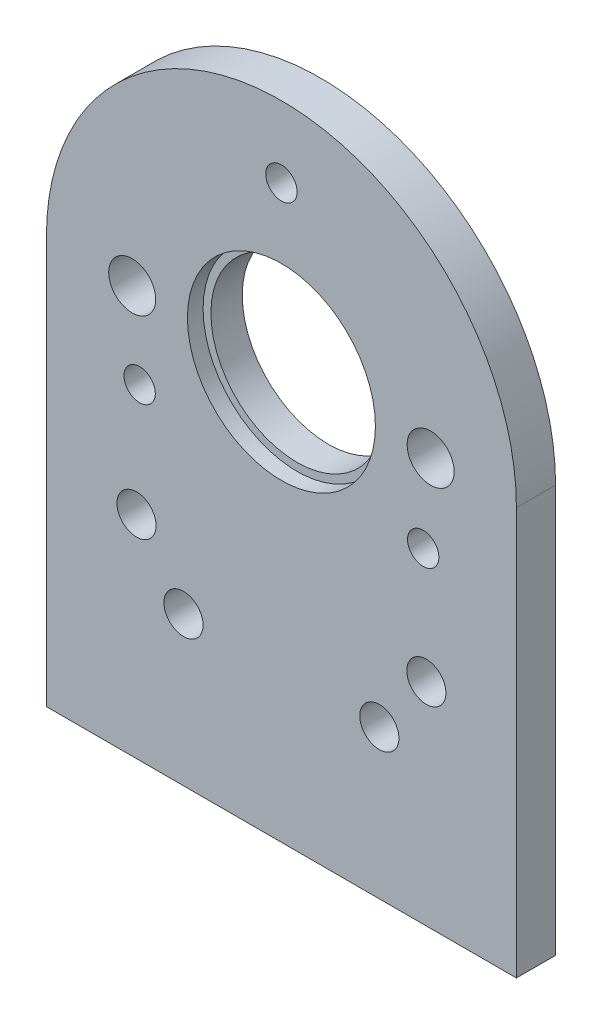
ISO-10303-21;
HEADER;
FILE_DESCRIPTION(('STEP AP214'),'2;1');
FILE_NAME('part.step','',(''),(''),'','','');
FILE_SCHEMA(('AUTOMOTIVE_DESIGN { 1 0 10303 214 1 1 1 1 }'));
ENDSEC;
DATA;
#1=APPLICATION_CONTEXT('core data for automotive mechanical design processes');
#2=APPLICATION_PROTOCOL_DEFINITION('international standard','automotive_design',2000,#1);
#3=PRODUCT_CONTEXT('',#1,'mechanical');
#4=PRODUCT('Part','Part','',(#3));
#5=PRODUCT_RELATED_PRODUCT_CATEGORY('part','',(#4));
#6=PRODUCT_DEFINITION_FORMATION('','',#4);
#7=PRODUCT_DEFINITION_CONTEXT('part definition',#1,'design');
#8=PRODUCT_DEFINITION('design','',#6,#7);
#9=PRODUCT_DEFINITION_SHAPE('','',#8);
#10=(LENGTH_UNIT() NAMED_UNIT(*) SI_UNIT(.MILLI.,.METRE.));
#11=(NAMED_UNIT(*) PLANE_ANGLE_UNIT() SI_UNIT($,.RADIAN.));
#12=(NAMED_UNIT(*) SI_UNIT($,.STERADIAN.) SOLID_ANGLE_UNIT());
#13=UNCERTAINTY_MEASURE_WITH_UNIT(LENGTH_MEASURE(1.E-05),#10,'distance_accuracy_value','');
#14=(GEOMETRIC_REPRESENTATION_CONTEXT(3) GLOBAL_UNCERTAINTY_ASSIGNED_CONTEXT((#13)) GLOBAL_UNIT_ASSIGNED_CONTEXT((#10,
#11,#12)) REPRESENTATION_CONTEXT('',''));
#15=CARTESIAN_POINT('',(0.,0.,0.));
#16=DIRECTION('',(0.,0.,1.));
#17=DIRECTION('',(1.,0.,0.));
#18=AXIS2_PLACEMENT_3D('',#15,#16,#17);
#19=CARTESIAN_POINT('',(0.,0.,0.5));
#20=DIRECTION('',(0.,0.,1.));
#21=DIRECTION('',(1.,0.,0.));
#22=AXIS2_PLACEMENT_3D('',#19,#20,#21);
#23=PLANE('',#22);
#24=CARTESIAN_POINT('',(0.,0.,0.5));
#25=DIRECTION('',(0.,0.,1.));
#26=DIRECTION('',(1.,0.,0.));
#27=AXIS2_PLACEMENT_3D('',#24,#25,#26);
#28=CIRCLE('',#27,15.);
#29=CARTESIAN_POINT('',(15.,0.,0.5));
#30=VERTEX_POINT('',#29);
#31=CARTESIAN_POINT('',(-15.,0.,0.5));
#32=VERTEX_POINT('',#31);
#33=EDGE_CURVE('E131',#30,#32,#28,.T.);
#34=ORIENTED_EDGE('',*,*,#33,.F.);
#35=DIRECTION('',(0.,1.,0.));
#36=VECTOR('',#35,1.);
#37=CARTESIAN_POINT('',(15.,-26.,0.5));
#38=LINE('',#37,#36);
#39=CARTESIAN_POINT('',(15.,-26.,0.5));
#40=VERTEX_POINT('',#39);
#41=EDGE_CURVE('E141',#40,#30,#38,.T.);
#42=ORIENTED_EDGE('',*,*,#41,.F.);
#43=DIRECTION('',(1.,0.,0.));
#44=VECTOR('',#43,1.);
#45=CARTESIAN_POINT('',(-15.,-26.,0.5));
#46=LINE('',#45,#44);
#47=CARTESIAN_POINT('',(-15.,-26.,0.5));
#48=VERTEX_POINT('',#47);
#49=EDGE_CURVE('E138',#48,#40,#46,.T.);
#50=ORIENTED_EDGE('',*,*,#49,.F.);
#51=DIRECTION('',(0.,-1.,0.));
#52=VECTOR('',#51,1.);
#53=CARTESIAN_POINT('',(-15.,0.,0.5));
#54=LINE('',#53,#52);
#55=EDGE_CURVE('E134',#32,#48,#54,.T.);
#56=ORIENTED_EDGE('',*,*,#55,.F.);
#57=EDGE_LOOP('',(#34,#42,#50,#56));
#58=FACE_BOUND('',#57,.T.);
#59=DIRECTION('',(-1.,0.,0.));
#60=VECTOR('',#59,1.);
#61=CARTESIAN_POINT('',(-14.25,-25.25,0.5));
#62=LINE('',#61,#60);
#63=CARTESIAN_POINT('',(14.25,-25.25,0.5));
#64=VERTEX_POINT('',#63);
#65=CARTESIAN_POINT('',(-14.25,-25.25,0.5));
#66=VERTEX_POINT('',#65);
#67=EDGE_CURVE('E121',#64,#66,#62,.T.);
#68=ORIENTED_EDGE('',*,*,#67,.F.);
#69=DIRECTION('',(0.,-1.,0.));
#70=VECTOR('',#69,1.);
#71=CARTESIAN_POINT('',(14.25,-25.25,0.5));
#72=LINE('',#71,#70);
#73=CARTESIAN_POINT('',(14.25,0.,0.5));
#74=VERTEX_POINT('',#73);
#75=EDGE_CURVE('E118',#74,#64,#72,.T.);
#76=ORIENTED_EDGE('',*,*,#75,.F.);
#77=CARTESIAN_POINT('',(0.,0.,0.5));
#78=DIRECTION('',(0.,0.,-1.));
#79=DIRECTION('',(1.,0.,0.));
#80=AXIS2_PLACEMENT_3D('',#77,#78,#79);
#81=CIRCLE('',#80,14.25);
#82=CARTESIAN_POINT('',(-14.25,0.,0.5));
#83=VERTEX_POINT('',#82);
#84=EDGE_CURVE('E57',#83,#74,#81,.T.);
#85=ORIENTED_EDGE('',*,*,#84,.F.);
#86=DIRECTION('',(0.,1.,0.));
#87=VECTOR('',#86,1.);
#88=CARTESIAN_POINT('',(-14.25,0.,0.5));
#89=LINE('',#88,#87);
#90=EDGE_CURVE('E52',#66,#83,#89,.T.);
#91=ORIENTED_EDGE('',*,*,#90,.F.);
#92=EDGE_LOOP('',(#68,#76,#85,#91));
#93=FACE_BOUND('',#92,.T.);
#94=ADVANCED_FACE('F35',(#58,#93),#23,.F.);
#95=CARTESIAN_POINT('',(0.,0.,0.5));
#96=DIRECTION('',(0.,0.,1.));
#97=DIRECTION('',(1.,0.,0.));
#98=AXIS2_PLACEMENT_3D('',#95,#96,#97);
#99=CYLINDRICAL_SURFACE('',#98,15.);
#100=CARTESIAN_POINT('',(0.,0.,3.));
#101=DIRECTION('',(0.,0.,1.));
#102=DIRECTION('',(1.,0.,0.));
#103=AXIS2_PLACEMENT_3D('',#100,#101,#102);
#104=CIRCLE('',#103,15.);
#105=CARTESIAN_POINT('',(15.,0.,3.));
#106=VERTEX_POINT('',#105);
#107=CARTESIAN_POINT('',(-15.,0.,3.));
#108=VERTEX_POINT('',#107);
#109=EDGE_CURVE('E122',#106,#108,#104,.T.);
#110=ORIENTED_EDGE('',*,*,#109,.F.);
#111=DIRECTION('',(0.,0.,1.));
#112=VECTOR('',#111,1.);
#113=CARTESIAN_POINT('',(15.,0.,0.5));
#114=LINE('',#113,#112);
#115=EDGE_CURVE('E11',#30,#106,#114,.T.);
#116=ORIENTED_EDGE('',*,*,#115,.F.);
#117=ORIENTED_EDGE('',*,*,#33,.T.);
#118=DIRECTION('',(0.,0.,1.));
#119=VECTOR('',#118,1.);
#120=CARTESIAN_POINT('',(-15.,0.,0.5));
#121=LINE('',#120,#119);
#122=EDGE_CURVE('E39',#32,#108,#121,.T.);
#123=ORIENTED_EDGE('',*,*,#122,.T.);
#124=EDGE_LOOP('',(#110,#116,#117,#123));
#125=FACE_BOUND('',#124,.T.);
#126=ADVANCED_FACE('F37',(#125),#99,.T.);
#127=CARTESIAN_POINT('',(15.,-26.,0.5));
#128=DIRECTION('',(1.,0.,0.));
#129=DIRECTION('',(0.,0.,-1.));
#130=AXIS2_PLACEMENT_3D('',#127,#128,#129);
#131=PLANE('',#130);
#132=DIRECTION('',(0.,1.,0.));
#133=VECTOR('',#132,1.);
#134=CARTESIAN_POINT('',(15.,-26.,3.));
#135=LINE('',#134,#133);
#136=CARTESIAN_POINT('',(15.,-26.,3.));
#137=VERTEX_POINT('',#136);
#138=EDGE_CURVE('E135',#137,#106,#135,.T.);
#139=ORIENTED_EDGE('',*,*,#138,.F.);
#140=DIRECTION('',(0.,0.,1.));
#141=VECTOR('',#140,1.);
#142=CARTESIAN_POINT('',(15.,-26.,0.5));
#143=LINE('',#142,#141);
#144=EDGE_CURVE('E44',#40,#137,#143,.T.);
#145=ORIENTED_EDGE('',*,*,#144,.F.);
#146=ORIENTED_EDGE('',*,*,#41,.T.);
#147=ORIENTED_EDGE('',*,*,#115,.T.);
#148=EDGE_LOOP('',(#139,#145,#146,#147));
#149=FACE_BOUND('',#148,.T.);
#150=ADVANCED_FACE('F164',(#149),#131,.T.);
#151=CARTESIAN_POINT('',(-15.,-26.,0.5));
#152=DIRECTION('',(0.,-1.,0.));
#153=DIRECTION('',(0.,0.,-1.));
#154=AXIS2_PLACEMENT_3D('',#151,#152,#153);
#155=PLANE('',#154);
#156=DIRECTION('',(1.,0.,0.));
#157=VECTOR('',#156,1.);
#158=CARTESIAN_POINT('',(-15.,-26.,3.));
#159=LINE('',#158,#157);
#160=CARTESIAN_POINT('',(-15.,-26.,3.));
#161=VERTEX_POINT('',#160);
#162=EDGE_CURVE('E146',#161,#137,#159,.T.);
#163=ORIENTED_EDGE('',*,*,#162,.F.);
#164=DIRECTION('',(0.,0.,1.));
#165=VECTOR('',#164,1.);
#166=CARTESIAN_POINT('',(-15.,-26.,0.5));
#167=LINE('',#166,#165);
#168=EDGE_CURVE('E151',#48,#161,#167,.T.);
#169=ORIENTED_EDGE('',*,*,#168,.F.);
#170=ORIENTED_EDGE('',*,*,#49,.T.);
#171=ORIENTED_EDGE('',*,*,#144,.T.);
#172=EDGE_LOOP('',(#163,#169,#170,#171));
#173=FACE_BOUND('',#172,.T.);
#174=ADVANCED_FACE('F169',(#173),#155,.T.);
#175=CARTESIAN_POINT('',(-15.,0.,0.5));
#176=DIRECTION('',(-1.,0.,0.));
#177=DIRECTION('',(0.,0.,1.));
#178=AXIS2_PLACEMENT_3D('',#175,#176,#177);
#179=PLANE('',#178);
#180=DIRECTION('',(0.,-1.,0.));
#181=VECTOR('',#180,1.);
#182=CARTESIAN_POINT('',(-15.,0.,3.));
#183=LINE('',#182,#181);
#184=EDGE_CURVE('E125',#108,#161,#183,.T.);
#185=ORIENTED_EDGE('',*,*,#184,.F.);
#186=ORIENTED_EDGE('',*,*,#122,.F.);
#187=ORIENTED_EDGE('',*,*,#55,.T.);
#188=ORIENTED_EDGE('',*,*,#168,.T.);
#189=EDGE_LOOP('',(#185,#186,#187,#188));
#190=FACE_BOUND('',#189,.T.);
#191=ADVANCED_FACE('F159',(#190),#179,.T.);
#192=CARTESIAN_POINT('',(0.,0.,3.));
#193=DIRECTION('',(0.,0.,1.));
#194=DIRECTION('',(1.,0.,0.));
#195=AXIS2_PLACEMENT_3D('',#192,#193,#194);
#196=PLANE('',#195);
#197=CARTESIAN_POINT('',(0.,0.,3.));
#198=DIRECTION('',(0.,0.,1.));
#199=DIRECTION('',(1.,0.,0.));
#200=AXIS2_PLACEMENT_3D('',#197,#198,#199);
#201=CIRCLE('',#200,5.99999999999999);
#202=CARTESIAN_POINT('',(5.99999999999999,0.,3.));
#203=VERTEX_POINT('',#202);
#204=EDGE_CURVE('E193',#203,#203,#201,.T.);
#205=ORIENTED_EDGE('',*,*,#204,.F.);
#206=EDGE_LOOP('',(#205));
#207=FACE_BOUND('',#206,.T.);
#208=CARTESIAN_POINT('',(0.,10.45,3.));
#209=DIRECTION('',(0.,0.,-1.));
#210=DIRECTION('',(-1.,0.,0.));
#211=AXIS2_PLACEMENT_3D('',#208,#209,#210);
#212=CIRCLE('',#211,0.999999999999987);
#213=CARTESIAN_POINT('',(-0.999999999999987,10.45,3.));
#214=VERTEX_POINT('',#213);
#215=EDGE_CURVE('E197',#214,#214,#212,.T.);
#216=ORIENTED_EDGE('',*,*,#215,.T.);
#217=EDGE_LOOP('',(#216));
#218=FACE_BOUND('',#217,.T.);
#219=CARTESIAN_POINT('',(-9.04996546954738,-5.225,3.));
#220=DIRECTION('',(0.,0.,-1.));
#221=DIRECTION('',(-1.,0.,0.));
#222=AXIS2_PLACEMENT_3D('',#219,#220,#221);
#223=CIRCLE('',#222,0.999999999999987);
#224=CARTESIAN_POINT('',(-10.0499654695474,-5.225,3.));
#225=VERTEX_POINT('',#224);
#226=EDGE_CURVE('E201',#225,#225,#223,.T.);
#227=ORIENTED_EDGE('',*,*,#226,.T.);
#228=EDGE_LOOP('',(#227));
#229=FACE_BOUND('',#228,.T.);
#230=CARTESIAN_POINT('',(9.04996546954736,-5.225,3.));
#231=DIRECTION('',(0.,0.,-1.));
#232=DIRECTION('',(-1.,0.,0.));
#233=AXIS2_PLACEMENT_3D('',#230,#231,#232);
#234=CIRCLE('',#233,0.999999999999987);
#235=CARTESIAN_POINT('',(8.04996546954737,-5.225,3.));
#236=VERTEX_POINT('',#235);
#237=EDGE_CURVE('E205',#236,#236,#234,.T.);
#238=ORIENTED_EDGE('',*,*,#237,.T.);
#239=EDGE_LOOP('',(#238));
#240=FACE_BOUND('',#239,.T.);
#241=CARTESIAN_POINT('',(9.525,0.,3.));
#242=DIRECTION('',(0.,0.,-1.));
#243=DIRECTION('',(-1.,0.,0.));
#244=AXIS2_PLACEMENT_3D('',#241,#242,#243);
#245=CIRCLE('',#244,1.49999999999999);
#246=CARTESIAN_POINT('',(8.02500000000001,0.,3.));
#247=VERTEX_POINT('',#246);
#248=EDGE_CURVE('E209',#247,#247,#245,.T.);
#249=ORIENTED_EDGE('',*,*,#248,.T.);
#250=EDGE_LOOP('',(#249));
#251=FACE_BOUND('',#250,.T.);
#252=CARTESIAN_POINT('',(-9.525,0.,3.));
#253=DIRECTION('',(0.,0.,-1.));
#254=DIRECTION('',(-1.,0.,0.));
#255=AXIS2_PLACEMENT_3D('',#252,#253,#254);
#256=CIRCLE('',#255,1.49999999999999);
#257=CARTESIAN_POINT('',(-11.025,0.,3.));
#258=VERTEX_POINT('',#257);
#259=EDGE_CURVE('E213',#258,#258,#256,.T.);
#260=ORIENTED_EDGE('',*,*,#259,.T.);
#261=EDGE_LOOP('',(#260));
#262=FACE_BOUND('',#261,.T.);
#263=CARTESIAN_POINT('',(-9.25,-12.5,3.));
#264=DIRECTION('',(0.,0.,-1.));
#265=DIRECTION('',(-1.,0.,0.));
#266=AXIS2_PLACEMENT_3D('',#263,#264,#265);
#267=CIRCLE('',#266,1.24999999999999);
#268=CARTESIAN_POINT('',(-10.5,-12.5,3.));
#269=VERTEX_POINT('',#268);
#270=EDGE_CURVE('E217',#269,#269,#267,.T.);
#271=ORIENTED_EDGE('',*,*,#270,.T.);
#272=EDGE_LOOP('',(#271));
#273=FACE_BOUND('',#272,.T.);
#274=CARTESIAN_POINT('',(9.25,-12.5,3.));
#275=DIRECTION('',(0.,0.,-1.));
#276=DIRECTION('',(-1.,0.,0.));
#277=AXIS2_PLACEMENT_3D('',#274,#275,#276);
#278=CIRCLE('',#277,1.24999999999999);
#279=CARTESIAN_POINT('',(8.00000000000001,-12.5,3.));
#280=VERTEX_POINT('',#279);
#281=EDGE_CURVE('E221',#280,#280,#278,.T.);
#282=ORIENTED_EDGE('',*,*,#281,.T.);
#283=EDGE_LOOP('',(#282));
#284=FACE_BOUND('',#283,.T.);
#285=CARTESIAN_POINT('',(-6.25,-16.5,3.));
#286=DIRECTION('',(0.,0.,-1.));
#287=DIRECTION('',(-1.,0.,0.));
#288=AXIS2_PLACEMENT_3D('',#285,#286,#287);
#289=CIRCLE('',#288,1.24999999999999);
#290=CARTESIAN_POINT('',(-7.49999999999999,-16.5,3.));
#291=VERTEX_POINT('',#290);
#292=EDGE_CURVE('E225',#291,#291,#289,.T.);
#293=ORIENTED_EDGE('',*,*,#292,.T.);
#294=EDGE_LOOP('',(#293));
#295=FACE_BOUND('',#294,.T.);
#296=CARTESIAN_POINT('',(6.25,-16.5,3.));
#297=DIRECTION('',(0.,0.,-1.));
#298=DIRECTION('',(-1.,0.,0.));
#299=AXIS2_PLACEMENT_3D('',#296,#297,#298);
#300=CIRCLE('',#299,1.24999999999999);
#301=CARTESIAN_POINT('',(5.00000000000001,-16.5,3.));
#302=VERTEX_POINT('',#301);
#303=EDGE_CURVE('E228',#302,#302,#300,.T.);
#304=ORIENTED_EDGE('',*,*,#303,.T.);
#305=EDGE_LOOP('',(#304));
#306=FACE_BOUND('',#305,.T.);
#307=ORIENTED_EDGE('',*,*,#109,.T.);
#308=ORIENTED_EDGE('',*,*,#184,.T.);
#309=ORIENTED_EDGE('',*,*,#162,.T.);
#310=ORIENTED_EDGE('',*,*,#138,.T.);
#311=EDGE_LOOP('',(#307,#308,#309,#310));
#312=FACE_BOUND('',#311,.T.);
#313=ADVANCED_FACE('F161',(#207,#218,#229,#240,#251,#262,#273,#284,#295,#306,#312),#196,.T.);
#314=CARTESIAN_POINT('',(-14.25,-25.25,0.));
#315=DIRECTION('',(0.,1.,0.));
#316=DIRECTION('',(0.,0.,1.));
#317=AXIS2_PLACEMENT_3D('',#314,#315,#316);
#318=PLANE('',#317);
#319=ORIENTED_EDGE('',*,*,#67,.T.);
#320=DIRECTION('',(0.,0.,1.));
#321=VECTOR('',#320,1.);
#322=CARTESIAN_POINT('',(-14.25,-25.25,0.));
#323=LINE('',#322,#321);
#324=CARTESIAN_POINT('',(-14.25,-25.25,0.));
#325=VERTEX_POINT('',#324);
#326=EDGE_CURVE('E102',#325,#66,#323,.T.);
#327=ORIENTED_EDGE('',*,*,#326,.F.);
#328=DIRECTION('',(-1.,0.,0.));
#329=VECTOR('',#328,1.);
#330=CARTESIAN_POINT('',(-14.25,-25.25,0.));
#331=LINE('',#330,#329);
#332=CARTESIAN_POINT('',(14.25,-25.25,0.));
#333=VERTEX_POINT('',#332);
#334=EDGE_CURVE('E109',#333,#325,#331,.T.);
#335=ORIENTED_EDGE('',*,*,#334,.F.);
#336=DIRECTION('',(0.,0.,1.));
#337=VECTOR('',#336,1.);
#338=CARTESIAN_POINT('',(14.25,-25.25,0.));
#339=LINE('',#338,#337);
#340=EDGE_CURVE('E238',#333,#64,#339,.T.);
#341=ORIENTED_EDGE('',*,*,#340,.T.);
#342=EDGE_LOOP('',(#319,#327,#335,#341));
#343=FACE_BOUND('',#342,.T.);
#344=ADVANCED_FACE('F120',(#343),#318,.F.);
#345=CARTESIAN_POINT('',(-14.25,0.,0.));
#346=DIRECTION('',(1.,0.,0.));
#347=DIRECTION('',(0.,0.,-1.));
#348=AXIS2_PLACEMENT_3D('',#345,#346,#347);
#349=PLANE('',#348);
#350=ORIENTED_EDGE('',*,*,#90,.T.);
#351=DIRECTION('',(0.,0.,1.));
#352=VECTOR('',#351,1.);
#353=CARTESIAN_POINT('',(-14.25,0.,0.));
#354=LINE('',#353,#352);
#355=CARTESIAN_POINT('',(-14.25,0.,0.));
#356=VERTEX_POINT('',#355);
#357=EDGE_CURVE('E105',#356,#83,#354,.T.);
#358=ORIENTED_EDGE('',*,*,#357,.F.);
#359=DIRECTION('',(0.,1.,0.));
#360=VECTOR('',#359,1.);
#361=CARTESIAN_POINT('',(-14.25,0.,0.));
#362=LINE('',#361,#360);
#363=EDGE_CURVE('E98',#325,#356,#362,.T.);
#364=ORIENTED_EDGE('',*,*,#363,.F.);
#365=ORIENTED_EDGE('',*,*,#326,.T.);
#366=EDGE_LOOP('',(#350,#358,#364,#365));
#367=FACE_BOUND('',#366,.T.);
#368=ADVANCED_FACE('F100',(#367),#349,.F.);
#369=CARTESIAN_POINT('',(0.,0.,0.));
#370=DIRECTION('',(0.,0.,1.));
#371=DIRECTION('',(1.,0.,0.));
#372=AXIS2_PLACEMENT_3D('',#369,#370,#371);
#373=CYLINDRICAL_SURFACE('',#372,14.25);
#374=ORIENTED_EDGE('',*,*,#84,.T.);
#375=DIRECTION('',(0.,0.,1.));
#376=VECTOR('',#375,1.);
#377=CARTESIAN_POINT('',(14.25,0.,0.));
#378=LINE('',#377,#376);
#379=CARTESIAN_POINT('',(14.25,0.,0.));
#380=VERTEX_POINT('',#379);
#381=EDGE_CURVE('E127',#380,#74,#378,.T.);
#382=ORIENTED_EDGE('',*,*,#381,.F.);
#383=CARTESIAN_POINT('',(0.,0.,0.));
#384=DIRECTION('',(0.,0.,-1.));
#385=DIRECTION('',(1.,0.,0.));
#386=AXIS2_PLACEMENT_3D('',#383,#384,#385);
#387=CIRCLE('',#386,14.25);
#388=EDGE_CURVE('E108',#356,#380,#387,.T.);
#389=ORIENTED_EDGE('',*,*,#388,.F.);
#390=ORIENTED_EDGE('',*,*,#357,.T.);
#391=EDGE_LOOP('',(#374,#382,#389,#390));
#392=FACE_BOUND('',#391,.T.);
#393=ADVANCED_FACE('F249',(#392),#373,.T.);
#394=CARTESIAN_POINT('',(14.25,-25.25,0.));
#395=DIRECTION('',(-1.,0.,0.));
#396=DIRECTION('',(0.,0.,1.));
#397=AXIS2_PLACEMENT_3D('',#394,#395,#396);
#398=PLANE('',#397);
#399=ORIENTED_EDGE('',*,*,#75,.T.);
#400=ORIENTED_EDGE('',*,*,#340,.F.);
#401=DIRECTION('',(0.,-1.,0.));
#402=VECTOR('',#401,1.);
#403=CARTESIAN_POINT('',(14.25,-25.25,0.));
#404=LINE('',#403,#402);
#405=EDGE_CURVE('E114',#380,#333,#404,.T.);
#406=ORIENTED_EDGE('',*,*,#405,.F.);
#407=ORIENTED_EDGE('',*,*,#381,.T.);
#408=EDGE_LOOP('',(#399,#400,#406,#407));
#409=FACE_BOUND('',#408,.T.);
#410=ADVANCED_FACE('F247',(#409),#398,.F.);
#411=CARTESIAN_POINT('',(0.,0.,0.));
#412=DIRECTION('',(0.,0.,1.));
#413=DIRECTION('',(1.,0.,0.));
#414=AXIS2_PLACEMENT_3D('',#411,#412,#413);
#415=PLANE('',#414);
#416=CARTESIAN_POINT('',(0.,0.,0.));
#417=DIRECTION('',(0.,0.,1.));
#418=DIRECTION('',(1.,0.,0.));
#419=AXIS2_PLACEMENT_3D('',#416,#417,#418);
#420=CIRCLE('',#419,5.50000000000001);
#421=CARTESIAN_POINT('',(5.50000000000001,0.,0.));
#422=VERTEX_POINT('',#421);
#423=EDGE_CURVE('E319',#422,#422,#420,.T.);
#424=ORIENTED_EDGE('',*,*,#423,.T.);
#425=EDGE_LOOP('',(#424));
#426=FACE_BOUND('',#425,.T.);
#427=CARTESIAN_POINT('',(0.,10.45,0.));
#428=DIRECTION('',(0.,0.,-1.));
#429=DIRECTION('',(-1.,0.,0.));
#430=AXIS2_PLACEMENT_3D('',#427,#428,#429);
#431=CIRCLE('',#430,0.999999999999987);
#432=CARTESIAN_POINT('',(-0.999999999999987,10.45,0.));
#433=VERTEX_POINT('',#432);
#434=EDGE_CURVE('E322',#433,#433,#431,.T.);
#435=ORIENTED_EDGE('',*,*,#434,.F.);
#436=EDGE_LOOP('',(#435));
#437=FACE_BOUND('',#436,.T.);
#438=CARTESIAN_POINT('',(-9.04996546954738,-5.225,0.));
#439=DIRECTION('',(0.,0.,-1.));
#440=DIRECTION('',(-1.,0.,0.));
#441=AXIS2_PLACEMENT_3D('',#438,#439,#440);
#442=CIRCLE('',#441,0.999999999999987);
#443=CARTESIAN_POINT('',(-10.0499654695474,-5.225,0.));
#444=VERTEX_POINT('',#443);
#445=EDGE_CURVE('E326',#444,#444,#442,.T.);
#446=ORIENTED_EDGE('',*,*,#445,.F.);
#447=EDGE_LOOP('',(#446));
#448=FACE_BOUND('',#447,.T.);
#449=CARTESIAN_POINT('',(9.04996546954736,-5.225,0.));
#450=DIRECTION('',(0.,0.,-1.));
#451=DIRECTION('',(-1.,0.,0.));
#452=AXIS2_PLACEMENT_3D('',#449,#450,#451);
#453=CIRCLE('',#452,0.999999999999987);
#454=CARTESIAN_POINT('',(8.04996546954737,-5.225,0.));
#455=VERTEX_POINT('',#454);
#456=EDGE_CURVE('E330',#455,#455,#453,.T.);
#457=ORIENTED_EDGE('',*,*,#456,.F.);
#458=EDGE_LOOP('',(#457));
#459=FACE_BOUND('',#458,.T.);
#460=CARTESIAN_POINT('',(9.525,0.,0.));
#461=DIRECTION('',(0.,0.,-1.));
#462=DIRECTION('',(-1.,0.,0.));
#463=AXIS2_PLACEMENT_3D('',#460,#461,#462);
#464=CIRCLE('',#463,1.49999999999999);
#465=CARTESIAN_POINT('',(8.02500000000001,0.,0.));
#466=VERTEX_POINT('',#465);
#467=EDGE_CURVE('E334',#466,#466,#464,.T.);
#468=ORIENTED_EDGE('',*,*,#467,.F.);
#469=EDGE_LOOP('',(#468));
#470=FACE_BOUND('',#469,.T.);
#471=CARTESIAN_POINT('',(-9.525,0.,0.));
#472=DIRECTION('',(0.,0.,-1.));
#473=DIRECTION('',(-1.,0.,0.));
#474=AXIS2_PLACEMENT_3D('',#471,#472,#473);
#475=CIRCLE('',#474,1.49999999999999);
#476=CARTESIAN_POINT('',(-11.025,0.,0.));
#477=VERTEX_POINT('',#476);
#478=EDGE_CURVE('E338',#477,#477,#475,.T.);
#479=ORIENTED_EDGE('',*,*,#478,.F.);
#480=EDGE_LOOP('',(#479));
#481=FACE_BOUND('',#480,.T.);
#482=CARTESIAN_POINT('',(-9.25,-12.5,0.));
#483=DIRECTION('',(0.,0.,-1.));
#484=DIRECTION('',(-1.,0.,0.));
#485=AXIS2_PLACEMENT_3D('',#482,#483,#484);
#486=CIRCLE('',#485,1.24999999999999);
#487=CARTESIAN_POINT('',(-10.5,-12.5,0.));
#488=VERTEX_POINT('',#487);
#489=EDGE_CURVE('E342',#488,#488,#486,.T.);
#490=ORIENTED_EDGE('',*,*,#489,.F.);
#491=EDGE_LOOP('',(#490));
#492=FACE_BOUND('',#491,.T.);
#493=CARTESIAN_POINT('',(9.25,-12.5,0.));
#494=DIRECTION('',(0.,0.,-1.));
#495=DIRECTION('',(-1.,0.,0.));
#496=AXIS2_PLACEMENT_3D('',#493,#494,#495);
#497=CIRCLE('',#496,1.24999999999999);
#498=CARTESIAN_POINT('',(8.00000000000001,-12.5,0.));
#499=VERTEX_POINT('',#498);
#500=EDGE_CURVE('E346',#499,#499,#497,.T.);
#501=ORIENTED_EDGE('',*,*,#500,.F.);
#502=EDGE_LOOP('',(#501));
#503=FACE_BOUND('',#502,.T.);
#504=CARTESIAN_POINT('',(-6.25,-16.5,0.));
#505=DIRECTION('',(0.,0.,-1.));
#506=DIRECTION('',(-1.,0.,0.));
#507=AXIS2_PLACEMENT_3D('',#504,#505,#506);
#508=CIRCLE('',#507,1.24999999999999);
#509=CARTESIAN_POINT('',(-7.49999999999999,-16.5,0.));
#510=VERTEX_POINT('',#509);
#511=EDGE_CURVE('E350',#510,#510,#508,.T.);
#512=ORIENTED_EDGE('',*,*,#511,.F.);
#513=EDGE_LOOP('',(#512));
#514=FACE_BOUND('',#513,.T.);
#515=CARTESIAN_POINT('',(6.25,-16.5,0.));
#516=DIRECTION('',(0.,0.,-1.));
#517=DIRECTION('',(-1.,0.,0.));
#518=AXIS2_PLACEMENT_3D('',#515,#516,#517);
#519=CIRCLE('',#518,1.24999999999999);
#520=CARTESIAN_POINT('',(5.00000000000001,-16.5,0.));
#521=VERTEX_POINT('',#520);
#522=EDGE_CURVE('E230',#521,#521,#519,.T.);
#523=ORIENTED_EDGE('',*,*,#522,.F.);
#524=EDGE_LOOP('',(#523));
#525=FACE_BOUND('',#524,.T.);
#526=ORIENTED_EDGE('',*,*,#334,.T.);
#527=ORIENTED_EDGE('',*,*,#363,.T.);
#528=ORIENTED_EDGE('',*,*,#388,.T.);
#529=ORIENTED_EDGE('',*,*,#405,.T.);
#530=EDGE_LOOP('',(#526,#527,#528,#529));
#531=FACE_BOUND('',#530,.T.);
#532=ADVANCED_FACE('F112',(#426,#437,#448,#459,#470,#481,#492,#503,#514,#525,#531),#415,.F.);
#533=CARTESIAN_POINT('',(6.25,-16.5,0.));
#534=DIRECTION('',(0.,0.,-1.));
#535=DIRECTION('',(-1.,0.,0.));
#536=AXIS2_PLACEMENT_3D('',#533,#534,#535);
#537=CYLINDRICAL_SURFACE('',#536,1.24999999999999);
#538=ORIENTED_EDGE('',*,*,#303,.F.);
#539=EDGE_LOOP('',(#538));
#540=FACE_BOUND('',#539,.T.);
#541=ORIENTED_EDGE('',*,*,#522,.T.);
#542=EDGE_LOOP('',(#541));
#543=FACE_BOUND('',#542,.T.);
#544=ADVANCED_FACE('F260',(#540,#543),#537,.F.);
#545=CARTESIAN_POINT('',(-6.25,-16.5,0.));
#546=DIRECTION('',(0.,0.,-1.));
#547=DIRECTION('',(-1.,0.,0.));
#548=AXIS2_PLACEMENT_3D('',#545,#546,#547);
#549=CYLINDRICAL_SURFACE('',#548,1.24999999999999);
#550=ORIENTED_EDGE('',*,*,#292,.F.);
#551=EDGE_LOOP('',(#550));
#552=FACE_BOUND('',#551,.T.);
#553=ORIENTED_EDGE('',*,*,#511,.T.);
#554=EDGE_LOOP('',(#553));
#555=FACE_BOUND('',#554,.T.);
#556=ADVANCED_FACE('F264',(#552,#555),#549,.F.);
#557=CARTESIAN_POINT('',(9.25,-12.5,0.));
#558=DIRECTION('',(0.,0.,-1.));
#559=DIRECTION('',(-1.,0.,0.));
#560=AXIS2_PLACEMENT_3D('',#557,#558,#559);
#561=CYLINDRICAL_SURFACE('',#560,1.24999999999999);
#562=ORIENTED_EDGE('',*,*,#281,.F.);
#563=EDGE_LOOP('',(#562));
#564=FACE_BOUND('',#563,.T.);
#565=ORIENTED_EDGE('',*,*,#500,.T.);
#566=EDGE_LOOP('',(#565));
#567=FACE_BOUND('',#566,.T.);
#568=ADVANCED_FACE('F267',(#564,#567),#561,.F.);
#569=CARTESIAN_POINT('',(-9.25,-12.5,0.));
#570=DIRECTION('',(0.,0.,-1.));
#571=DIRECTION('',(-1.,0.,0.));
#572=AXIS2_PLACEMENT_3D('',#569,#570,#571);
#573=CYLINDRICAL_SURFACE('',#572,1.24999999999999);
#574=ORIENTED_EDGE('',*,*,#270,.F.);
#575=EDGE_LOOP('',(#574));
#576=FACE_BOUND('',#575,.T.);
#577=ORIENTED_EDGE('',*,*,#489,.T.);
#578=EDGE_LOOP('',(#577));
#579=FACE_BOUND('',#578,.T.);
#580=ADVANCED_FACE('F271',(#576,#579),#573,.F.);
#581=CARTESIAN_POINT('',(-9.525,0.,0.));
#582=DIRECTION('',(0.,0.,-1.));
#583=DIRECTION('',(-1.,0.,0.));
#584=AXIS2_PLACEMENT_3D('',#581,#582,#583);
#585=CYLINDRICAL_SURFACE('',#584,1.49999999999999);
#586=ORIENTED_EDGE('',*,*,#259,.F.);
#587=EDGE_LOOP('',(#586));
#588=FACE_BOUND('',#587,.T.);
#589=ORIENTED_EDGE('',*,*,#478,.T.);
#590=EDGE_LOOP('',(#589));
#591=FACE_BOUND('',#590,.T.);
#592=ADVANCED_FACE('F275',(#588,#591),#585,.F.);
#593=CARTESIAN_POINT('',(9.525,0.,0.));
#594=DIRECTION('',(0.,0.,-1.));
#595=DIRECTION('',(-1.,0.,0.));
#596=AXIS2_PLACEMENT_3D('',#593,#594,#595);
#597=CYLINDRICAL_SURFACE('',#596,1.49999999999999);
#598=ORIENTED_EDGE('',*,*,#248,.F.);
#599=EDGE_LOOP('',(#598));
#600=FACE_BOUND('',#599,.T.);
#601=ORIENTED_EDGE('',*,*,#467,.T.);
#602=EDGE_LOOP('',(#601));
#603=FACE_BOUND('',#602,.T.);
#604=ADVANCED_FACE('F279',(#600,#603),#597,.F.);
#605=CARTESIAN_POINT('',(9.04996546954736,-5.225,0.));
#606=DIRECTION('',(0.,0.,-1.));
#607=DIRECTION('',(-1.,0.,0.));
#608=AXIS2_PLACEMENT_3D('',#605,#606,#607);
#609=CYLINDRICAL_SURFACE('',#608,0.999999999999987);
#610=ORIENTED_EDGE('',*,*,#237,.F.);
#611=EDGE_LOOP('',(#610));
#612=FACE_BOUND('',#611,.T.);
#613=ORIENTED_EDGE('',*,*,#456,.T.);
#614=EDGE_LOOP('',(#613));
#615=FACE_BOUND('',#614,.T.);
#616=ADVANCED_FACE('F283',(#612,#615),#609,.F.);
#617=CARTESIAN_POINT('',(-9.04996546954738,-5.225,0.));
#618=DIRECTION('',(0.,0.,-1.));
#619=DIRECTION('',(-1.,0.,0.));
#620=AXIS2_PLACEMENT_3D('',#617,#618,#619);
#621=CYLINDRICAL_SURFACE('',#620,0.999999999999987);
#622=ORIENTED_EDGE('',*,*,#226,.F.);
#623=EDGE_LOOP('',(#622));
#624=FACE_BOUND('',#623,.T.);
#625=ORIENTED_EDGE('',*,*,#445,.T.);
#626=EDGE_LOOP('',(#625));
#627=FACE_BOUND('',#626,.T.);
#628=ADVANCED_FACE('F287',(#624,#627),#621,.F.);
#629=CARTESIAN_POINT('',(0.,10.45,0.));
#630=DIRECTION('',(0.,0.,-1.));
#631=DIRECTION('',(-1.,0.,0.));
#632=AXIS2_PLACEMENT_3D('',#629,#630,#631);
#633=CYLINDRICAL_SURFACE('',#632,0.999999999999987);
#634=ORIENTED_EDGE('',*,*,#215,.F.);
#635=EDGE_LOOP('',(#634));
#636=FACE_BOUND('',#635,.T.);
#637=ORIENTED_EDGE('',*,*,#434,.T.);
#638=EDGE_LOOP('',(#637));
#639=FACE_BOUND('',#638,.T.);
#640=ADVANCED_FACE('F291',(#636,#639),#633,.F.);
#641=CARTESIAN_POINT('',(0.,0.,3.));
#642=DIRECTION('',(0.,0.,1.));
#643=DIRECTION('',(1.,0.,0.));
#644=AXIS2_PLACEMENT_3D('',#641,#642,#643);
#645=CYLINDRICAL_SURFACE('',#644,5.50000000000001);
#646=ORIENTED_EDGE('',*,*,#423,.F.);
#647=EDGE_LOOP('',(#646));
#648=FACE_BOUND('',#647,.T.);
#649=CARTESIAN_POINT('',(0.,0.,2.));
#650=DIRECTION('',(0.,0.,1.));
#651=DIRECTION('',(1.,0.,0.));
#652=AXIS2_PLACEMENT_3D('',#649,#650,#651);
#653=CIRCLE('',#652,5.50000000000001);
#654=CARTESIAN_POINT('',(5.50000000000001,0.,2.));
#655=VERTEX_POINT('',#654);
#656=EDGE_CURVE('E314',#655,#655,#653,.T.);
#657=ORIENTED_EDGE('',*,*,#656,.T.);
#658=EDGE_LOOP('',(#657));
#659=FACE_BOUND('',#658,.T.);
#660=ADVANCED_FACE('F295',(#648,#659),#645,.F.);
#661=CARTESIAN_POINT('',(5.50000000000001,0.,2.));
#662=DIRECTION('',(0.,0.,-1.));
#663=DIRECTION('',(-1.,0.,0.));
#664=AXIS2_PLACEMENT_3D('',#661,#662,#663);
#665=PLANE('',#664);
#666=ORIENTED_EDGE('',*,*,#656,.F.);
#667=EDGE_LOOP('',(#666));
#668=FACE_BOUND('',#667,.T.);
#669=CARTESIAN_POINT('',(0.,0.,2.));
#670=DIRECTION('',(0.,0.,1.));
#671=DIRECTION('',(1.,0.,0.));
#672=AXIS2_PLACEMENT_3D('',#669,#670,#671);
#673=CIRCLE('',#672,5.99999999999999);
#674=CARTESIAN_POINT('',(5.99999999999999,0.,2.));
#675=VERTEX_POINT('',#674);
#676=EDGE_CURVE('E312',#675,#675,#673,.T.);
#677=ORIENTED_EDGE('',*,*,#676,.T.);
#678=EDGE_LOOP('',(#677));
#679=FACE_BOUND('',#678,.T.);
#680=ADVANCED_FACE('F299',(#668,#679),#665,.F.);
#681=CARTESIAN_POINT('',(0.,0.,3.));
#682=DIRECTION('',(0.,0.,1.));
#683=DIRECTION('',(1.,0.,0.));
#684=AXIS2_PLACEMENT_3D('',#681,#682,#683);
#685=CYLINDRICAL_SURFACE('',#684,5.99999999999999);
#686=ORIENTED_EDGE('',*,*,#676,.F.);
#687=EDGE_LOOP('',(#686));
#688=FACE_BOUND('',#687,.T.);
#689=ORIENTED_EDGE('',*,*,#204,.T.);
#690=EDGE_LOOP('',(#689));
#691=FACE_BOUND('',#690,.T.);
#692=ADVANCED_FACE('F303',(#688,#691),#685,.F.);
#693=CLOSED_SHELL('',(#94,#126,#150,#174,#191,#313,#344,#368,#393,#410,#532,#544,#556,#568,#580,
#592,#604,#616,#628,#640,#660,#680,#692));
#694=MANIFOLD_SOLID_BREP('B2',#693);
#695=ADVANCED_BREP_SHAPE_REPRESENTATION('',(#18,#694),#14);
#696=SHAPE_DEFINITION_REPRESENTATION(#9,#695);
ENDSEC;
END-ISO-10303-21;
